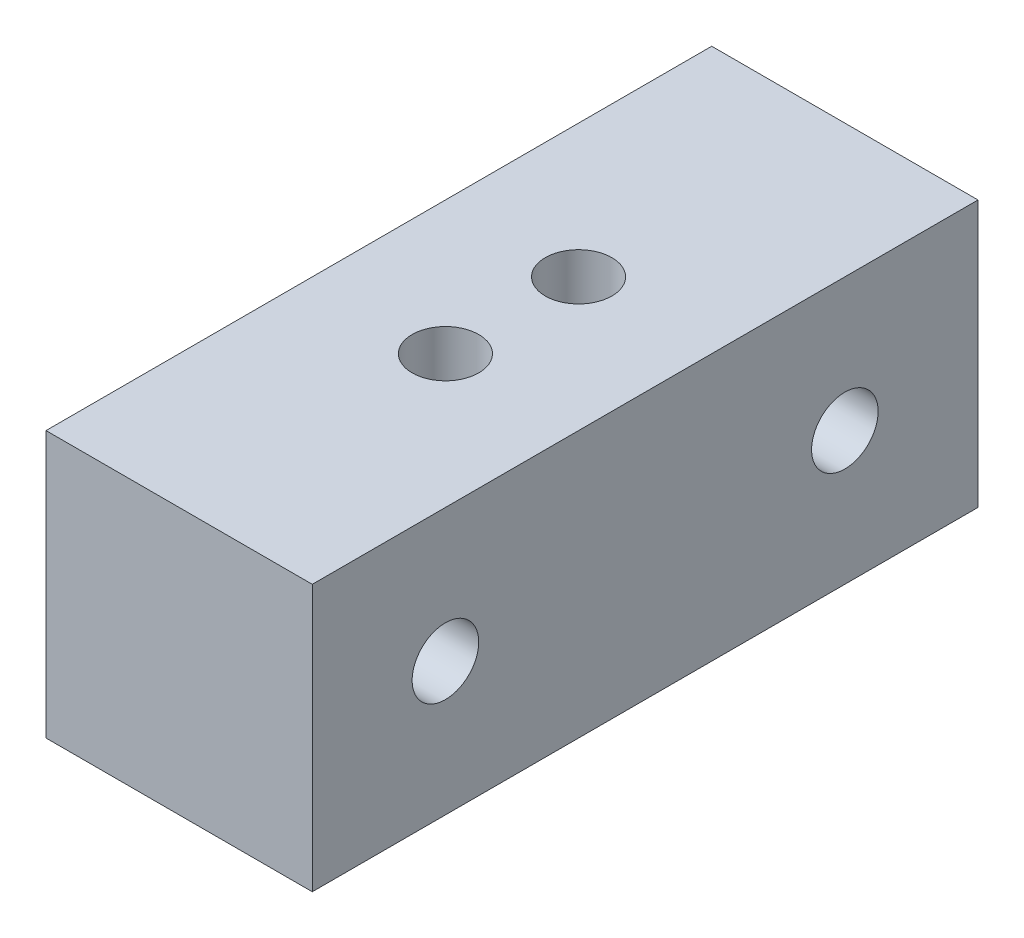
ISO-10303-21;
HEADER;
FILE_DESCRIPTION(('STEP AP214'),'2;1');
FILE_NAME('part.step','',(''),(''),'','','');
FILE_SCHEMA(('AUTOMOTIVE_DESIGN { 1 0 10303 214 1 1 1 1 }'));
ENDSEC;
DATA;
#1=APPLICATION_CONTEXT('core data for automotive mechanical design processes');
#2=APPLICATION_PROTOCOL_DEFINITION('international standard','automotive_design',2000,#1);
#3=PRODUCT_CONTEXT('',#1,'mechanical');
#4=PRODUCT('Part','Part','',(#3));
#5=PRODUCT_RELATED_PRODUCT_CATEGORY('part','',(#4));
#6=PRODUCT_DEFINITION_FORMATION('','',#4);
#7=PRODUCT_DEFINITION_CONTEXT('part definition',#1,'design');
#8=PRODUCT_DEFINITION('design','',#6,#7);
#9=PRODUCT_DEFINITION_SHAPE('','',#8);
#10=(LENGTH_UNIT() NAMED_UNIT(*) SI_UNIT(.MILLI.,.METRE.));
#11=(NAMED_UNIT(*) PLANE_ANGLE_UNIT() SI_UNIT($,.RADIAN.));
#12=(NAMED_UNIT(*) SI_UNIT($,.STERADIAN.) SOLID_ANGLE_UNIT());
#13=UNCERTAINTY_MEASURE_WITH_UNIT(LENGTH_MEASURE(1.E-05),#10,'distance_accuracy_value','');
#14=(GEOMETRIC_REPRESENTATION_CONTEXT(3) GLOBAL_UNCERTAINTY_ASSIGNED_CONTEXT((#13)) GLOBAL_UNIT_ASSIGNED_CONTEXT((#10,
#11,#12)) REPRESENTATION_CONTEXT('',''));
#15=CARTESIAN_POINT('',(0.,0.,0.));
#16=DIRECTION('',(0.,0.,1.));
#17=DIRECTION('',(1.,0.,0.));
#18=AXIS2_PLACEMENT_3D('',#15,#16,#17);
#19=CARTESIAN_POINT('',(0.,20.,50.));
#20=DIRECTION('',(1.,0.,0.));
#21=DIRECTION('',(0.,0.,-1.));
#22=AXIS2_PLACEMENT_3D('',#19,#20,#21);
#23=PLANE('',#22);
#24=DIRECTION('',(0.,-1.,0.));
#25=VECTOR('',#24,1.);
#26=CARTESIAN_POINT('',(0.,20.,0.));
#27=LINE('',#26,#25);
#28=CARTESIAN_POINT('',(0.,20.,0.));
#29=VERTEX_POINT('',#28);
#30=CARTESIAN_POINT('',(0.,0.,0.));
#31=VERTEX_POINT('',#30);
#32=EDGE_CURVE('E115',#29,#31,#27,.T.);
#33=ORIENTED_EDGE('',*,*,#32,.T.);
#34=DIRECTION('',(0.,0.,-1.));
#35=VECTOR('',#34,1.);
#36=CARTESIAN_POINT('',(0.,0.,50.));
#37=LINE('',#36,#35);
#38=CARTESIAN_POINT('',(0.,0.,50.));
#39=VERTEX_POINT('',#38);
#40=EDGE_CURVE('E11',#39,#31,#37,.T.);
#41=ORIENTED_EDGE('',*,*,#40,.F.);
#42=DIRECTION('',(0.,-1.,0.));
#43=VECTOR('',#42,1.);
#44=CARTESIAN_POINT('',(0.,20.,50.));
#45=LINE('',#44,#43);
#46=CARTESIAN_POINT('',(0.,20.,50.));
#47=VERTEX_POINT('',#46);
#48=EDGE_CURVE('E99',#47,#39,#45,.T.);
#49=ORIENTED_EDGE('',*,*,#48,.F.);
#50=DIRECTION('',(0.,0.,-1.));
#51=VECTOR('',#50,1.);
#52=CARTESIAN_POINT('',(0.,20.,50.));
#53=LINE('',#52,#51);
#54=EDGE_CURVE('E111',#47,#29,#53,.T.);
#55=ORIENTED_EDGE('',*,*,#54,.T.);
#56=EDGE_LOOP('',(#33,#41,#49,#55));
#57=FACE_BOUND('',#56,.T.);
#58=ADVANCED_FACE('F47',(#57),#23,.F.);
#59=CARTESIAN_POINT('',(0.,0.,50.));
#60=DIRECTION('',(0.,1.,0.));
#61=DIRECTION('',(0.,0.,1.));
#62=AXIS2_PLACEMENT_3D('',#59,#60,#61);
#63=PLANE('',#62);
#64=DIRECTION('',(1.,0.,0.));
#65=VECTOR('',#64,1.);
#66=CARTESIAN_POINT('',(0.,0.,0.));
#67=LINE('',#66,#65);
#68=CARTESIAN_POINT('',(20.,0.,0.));
#69=VERTEX_POINT('',#68);
#70=EDGE_CURVE('E104',#31,#69,#67,.T.);
#71=ORIENTED_EDGE('',*,*,#70,.T.);
#72=DIRECTION('',(0.,0.,-1.));
#73=VECTOR('',#72,1.);
#74=CARTESIAN_POINT('',(20.,0.,50.));
#75=LINE('',#74,#73);
#76=CARTESIAN_POINT('',(20.,0.,50.));
#77=VERTEX_POINT('',#76);
#78=EDGE_CURVE('E56',#77,#69,#75,.T.);
#79=ORIENTED_EDGE('',*,*,#78,.F.);
#80=DIRECTION('',(1.,0.,0.));
#81=VECTOR('',#80,1.);
#82=CARTESIAN_POINT('',(0.,0.,50.));
#83=LINE('',#82,#81);
#84=EDGE_CURVE('E94',#39,#77,#83,.T.);
#85=ORIENTED_EDGE('',*,*,#84,.F.);
#86=ORIENTED_EDGE('',*,*,#40,.T.);
#87=EDGE_LOOP('',(#71,#79,#85,#86));
#88=FACE_BOUND('',#87,.T.);
#89=ADVANCED_FACE('F103',(#88),#63,.F.);
#90=CARTESIAN_POINT('',(20.,0.,50.));
#91=DIRECTION('',(-1.,0.,0.));
#92=DIRECTION('',(0.,0.,1.));
#93=AXIS2_PLACEMENT_3D('',#90,#91,#92);
#94=PLANE('',#93);
#95=CARTESIAN_POINT('',(20.,10.,10.));
#96=DIRECTION('',(1.,0.,0.));
#97=DIRECTION('',(0.,0.,-1.));
#98=AXIS2_PLACEMENT_3D('',#95,#96,#97);
#99=CIRCLE('',#98,2.5);
#100=CARTESIAN_POINT('',(20.,10.,7.5));
#101=VERTEX_POINT('',#100);
#102=EDGE_CURVE('E145',#101,#101,#99,.T.);
#103=ORIENTED_EDGE('',*,*,#102,.F.);
#104=EDGE_LOOP('',(#103));
#105=FACE_BOUND('',#104,.T.);
#106=CARTESIAN_POINT('',(20.,10.,40.));
#107=DIRECTION('',(1.,0.,0.));
#108=DIRECTION('',(0.,0.,-1.));
#109=AXIS2_PLACEMENT_3D('',#106,#107,#108);
#110=CIRCLE('',#109,2.5);
#111=CARTESIAN_POINT('',(20.,10.,37.5));
#112=VERTEX_POINT('',#111);
#113=EDGE_CURVE('E140',#112,#112,#110,.T.);
#114=ORIENTED_EDGE('',*,*,#113,.F.);
#115=EDGE_LOOP('',(#114));
#116=FACE_BOUND('',#115,.T.);
#117=DIRECTION('',(0.,1.,0.));
#118=VECTOR('',#117,1.);
#119=CARTESIAN_POINT('',(20.,0.,0.));
#120=LINE('',#119,#118);
#121=CARTESIAN_POINT('',(20.,20.,0.));
#122=VERTEX_POINT('',#121);
#123=EDGE_CURVE('E81',#69,#122,#120,.T.);
#124=ORIENTED_EDGE('',*,*,#123,.T.);
#125=DIRECTION('',(0.,0.,-1.));
#126=VECTOR('',#125,1.);
#127=CARTESIAN_POINT('',(20.,20.,50.));
#128=LINE('',#127,#126);
#129=CARTESIAN_POINT('',(20.,20.,50.));
#130=VERTEX_POINT('',#129);
#131=EDGE_CURVE('E106',#130,#122,#128,.T.);
#132=ORIENTED_EDGE('',*,*,#131,.F.);
#133=DIRECTION('',(0.,1.,0.));
#134=VECTOR('',#133,1.);
#135=CARTESIAN_POINT('',(20.,0.,50.));
#136=LINE('',#135,#134);
#137=EDGE_CURVE('E97',#77,#130,#136,.T.);
#138=ORIENTED_EDGE('',*,*,#137,.F.);
#139=ORIENTED_EDGE('',*,*,#78,.T.);
#140=EDGE_LOOP('',(#124,#132,#138,#139));
#141=FACE_BOUND('',#140,.T.);
#142=ADVANCED_FACE('F107',(#105,#116,#141),#94,.F.);
#143=CARTESIAN_POINT('',(20.,20.,50.));
#144=DIRECTION('',(0.,-1.,0.));
#145=DIRECTION('',(0.,0.,-1.));
#146=AXIS2_PLACEMENT_3D('',#143,#144,#145);
#147=PLANE('',#146);
#148=CARTESIAN_POINT('',(10.,20.,20.));
#149=DIRECTION('',(0.,1.,0.));
#150=DIRECTION('',(0.,0.,1.));
#151=AXIS2_PLACEMENT_3D('',#148,#149,#150);
#152=CIRCLE('',#151,2.5);
#153=CARTESIAN_POINT('',(10.,20.,22.5));
#154=VERTEX_POINT('',#153);
#155=EDGE_CURVE('E160',#154,#154,#152,.T.);
#156=ORIENTED_EDGE('',*,*,#155,.F.);
#157=EDGE_LOOP('',(#156));
#158=FACE_BOUND('',#157,.T.);
#159=CARTESIAN_POINT('',(10.,20.,30.));
#160=DIRECTION('',(0.,1.,0.));
#161=DIRECTION('',(0.,0.,1.));
#162=AXIS2_PLACEMENT_3D('',#159,#160,#161);
#163=CIRCLE('',#162,2.5);
#164=CARTESIAN_POINT('',(10.,20.,32.5));
#165=VERTEX_POINT('',#164);
#166=EDGE_CURVE('E156',#165,#165,#163,.T.);
#167=ORIENTED_EDGE('',*,*,#166,.F.);
#168=EDGE_LOOP('',(#167));
#169=FACE_BOUND('',#168,.T.);
#170=DIRECTION('',(-1.,0.,0.));
#171=VECTOR('',#170,1.);
#172=CARTESIAN_POINT('',(20.,20.,0.));
#173=LINE('',#172,#171);
#174=EDGE_CURVE('E87',#122,#29,#173,.T.);
#175=ORIENTED_EDGE('',*,*,#174,.T.);
#176=ORIENTED_EDGE('',*,*,#54,.F.);
#177=DIRECTION('',(-1.,0.,0.));
#178=VECTOR('',#177,1.);
#179=CARTESIAN_POINT('',(20.,20.,50.));
#180=LINE('',#179,#178);
#181=EDGE_CURVE('E64',#130,#47,#180,.T.);
#182=ORIENTED_EDGE('',*,*,#181,.F.);
#183=ORIENTED_EDGE('',*,*,#131,.T.);
#184=EDGE_LOOP('',(#175,#176,#182,#183));
#185=FACE_BOUND('',#184,.T.);
#186=ADVANCED_FACE('F129',(#158,#169,#185),#147,.F.);
#187=CARTESIAN_POINT('',(0.,0.,50.));
#188=DIRECTION('',(0.,0.,1.));
#189=DIRECTION('',(1.,0.,0.));
#190=AXIS2_PLACEMENT_3D('',#187,#188,#189);
#191=PLANE('',#190);
#192=ORIENTED_EDGE('',*,*,#48,.T.);
#193=ORIENTED_EDGE('',*,*,#84,.T.);
#194=ORIENTED_EDGE('',*,*,#137,.T.);
#195=ORIENTED_EDGE('',*,*,#181,.T.);
#196=EDGE_LOOP('',(#192,#193,#194,#195));
#197=FACE_BOUND('',#196,.T.);
#198=ADVANCED_FACE('F95',(#197),#191,.T.);
#199=CARTESIAN_POINT('',(0.,0.,0.));
#200=DIRECTION('',(0.,0.,1.));
#201=DIRECTION('',(1.,0.,0.));
#202=AXIS2_PLACEMENT_3D('',#199,#200,#201);
#203=PLANE('',#202);
#204=ORIENTED_EDGE('',*,*,#32,.F.);
#205=ORIENTED_EDGE('',*,*,#174,.F.);
#206=ORIENTED_EDGE('',*,*,#123,.F.);
#207=ORIENTED_EDGE('',*,*,#70,.F.);
#208=EDGE_LOOP('',(#204,#205,#206,#207));
#209=FACE_BOUND('',#208,.T.);
#210=ADVANCED_FACE('F132',(#209),#203,.F.);
#211=CARTESIAN_POINT('',(6.,10.,40.));
#212=DIRECTION('',(1.,0.,0.));
#213=DIRECTION('',(0.,0.,-1.));
#214=AXIS2_PLACEMENT_3D('',#211,#212,#213);
#215=CYLINDRICAL_SURFACE('',#214,2.5);
#216=CARTESIAN_POINT('',(6.,10.,40.));
#217=DIRECTION('',(1.,0.,0.));
#218=DIRECTION('',(0.,0.,-1.));
#219=AXIS2_PLACEMENT_3D('',#216,#217,#218);
#220=CIRCLE('',#219,2.5);
#221=CARTESIAN_POINT('',(6.,10.,37.5));
#222=VERTEX_POINT('',#221);
#223=EDGE_CURVE('E136',#222,#222,#220,.T.);
#224=ORIENTED_EDGE('',*,*,#223,.F.);
#225=EDGE_LOOP('',(#224));
#226=FACE_BOUND('',#225,.T.);
#227=ORIENTED_EDGE('',*,*,#113,.T.);
#228=EDGE_LOOP('',(#227));
#229=FACE_BOUND('',#228,.T.);
#230=ADVANCED_FACE('F210',(#226,#229),#215,.F.);
#231=CARTESIAN_POINT('',(6.,10.,40.));
#232=DIRECTION('',(1.,0.,0.));
#233=DIRECTION('',(0.,0.,-1.));
#234=AXIS2_PLACEMENT_3D('',#231,#232,#233);
#235=PLANE('',#234);
#236=ORIENTED_EDGE('',*,*,#223,.T.);
#237=EDGE_LOOP('',(#236));
#238=FACE_BOUND('',#237,.T.);
#239=ADVANCED_FACE('F212',(#238),#235,.T.);
#240=CARTESIAN_POINT('',(6.,10.,10.));
#241=DIRECTION('',(1.,0.,0.));
#242=DIRECTION('',(0.,0.,-1.));
#243=AXIS2_PLACEMENT_3D('',#240,#241,#242);
#244=CYLINDRICAL_SURFACE('',#243,2.5);
#245=CARTESIAN_POINT('',(6.,10.,10.));
#246=DIRECTION('',(1.,0.,0.));
#247=DIRECTION('',(0.,0.,-1.));
#248=AXIS2_PLACEMENT_3D('',#245,#246,#247);
#249=CIRCLE('',#248,2.5);
#250=CARTESIAN_POINT('',(6.,10.,7.5));
#251=VERTEX_POINT('',#250);
#252=EDGE_CURVE('E119',#251,#251,#249,.T.);
#253=ORIENTED_EDGE('',*,*,#252,.F.);
#254=EDGE_LOOP('',(#253));
#255=FACE_BOUND('',#254,.T.);
#256=ORIENTED_EDGE('',*,*,#102,.T.);
#257=EDGE_LOOP('',(#256));
#258=FACE_BOUND('',#257,.T.);
#259=ADVANCED_FACE('F193',(#255,#258),#244,.F.);
#260=CARTESIAN_POINT('',(6.,10.,10.));
#261=DIRECTION('',(1.,0.,0.));
#262=DIRECTION('',(0.,0.,-1.));
#263=AXIS2_PLACEMENT_3D('',#260,#261,#262);
#264=PLANE('',#263);
#265=ORIENTED_EDGE('',*,*,#252,.T.);
#266=EDGE_LOOP('',(#265));
#267=FACE_BOUND('',#266,.T.);
#268=ADVANCED_FACE('F184',(#267),#264,.T.);
#269=CARTESIAN_POINT('',(10.,6.,30.));
#270=DIRECTION('',(0.,1.,0.));
#271=DIRECTION('',(0.,0.,1.));
#272=AXIS2_PLACEMENT_3D('',#269,#270,#271);
#273=CYLINDRICAL_SURFACE('',#272,2.5);
#274=CARTESIAN_POINT('',(10.,6.,30.));
#275=DIRECTION('',(0.,1.,0.));
#276=DIRECTION('',(0.,0.,1.));
#277=AXIS2_PLACEMENT_3D('',#274,#275,#276);
#278=CIRCLE('',#277,2.5);
#279=CARTESIAN_POINT('',(10.,6.,32.5));
#280=VERTEX_POINT('',#279);
#281=EDGE_CURVE('E152',#280,#280,#278,.T.);
#282=ORIENTED_EDGE('',*,*,#281,.F.);
#283=EDGE_LOOP('',(#282));
#284=FACE_BOUND('',#283,.T.);
#285=ORIENTED_EDGE('',*,*,#166,.T.);
#286=EDGE_LOOP('',(#285));
#287=FACE_BOUND('',#286,.T.);
#288=ADVANCED_FACE('F182',(#284,#287),#273,.F.);
#289=CARTESIAN_POINT('',(10.,6.,30.));
#290=DIRECTION('',(0.,1.,0.));
#291=DIRECTION('',(0.,0.,1.));
#292=AXIS2_PLACEMENT_3D('',#289,#290,#291);
#293=PLANE('',#292);
#294=ORIENTED_EDGE('',*,*,#281,.T.);
#295=EDGE_LOOP('',(#294));
#296=FACE_BOUND('',#295,.T.);
#297=ADVANCED_FACE('F173',(#296),#293,.T.);
#298=CARTESIAN_POINT('',(10.,6.,20.));
#299=DIRECTION('',(0.,1.,0.));
#300=DIRECTION('',(0.,0.,1.));
#301=AXIS2_PLACEMENT_3D('',#298,#299,#300);
#302=CYLINDRICAL_SURFACE('',#301,2.5);
#303=CARTESIAN_POINT('',(10.,6.,20.));
#304=DIRECTION('',(0.,1.,0.));
#305=DIRECTION('',(0.,0.,1.));
#306=AXIS2_PLACEMENT_3D('',#303,#304,#305);
#307=CIRCLE('',#306,2.5);
#308=CARTESIAN_POINT('',(10.,6.,22.5));
#309=VERTEX_POINT('',#308);
#310=EDGE_CURVE('E141',#309,#309,#307,.T.);
#311=ORIENTED_EDGE('',*,*,#310,.F.);
#312=EDGE_LOOP('',(#311));
#313=FACE_BOUND('',#312,.T.);
#314=ORIENTED_EDGE('',*,*,#155,.T.);
#315=EDGE_LOOP('',(#314));
#316=FACE_BOUND('',#315,.T.);
#317=ADVANCED_FACE('F170',(#313,#316),#302,.F.);
#318=CARTESIAN_POINT('',(10.,6.,20.));
#319=DIRECTION('',(0.,1.,0.));
#320=DIRECTION('',(0.,0.,1.));
#321=AXIS2_PLACEMENT_3D('',#318,#319,#320);
#322=PLANE('',#321);
#323=ORIENTED_EDGE('',*,*,#310,.T.);
#324=EDGE_LOOP('',(#323));
#325=FACE_BOUND('',#324,.T.);
#326=ADVANCED_FACE('F168',(#325),#322,.T.);
#327=CLOSED_SHELL('',(#58,#89,#142,#186,#198,#210,#230,#239,#259,#268,#288,#297,#317,#326));
#328=MANIFOLD_SOLID_BREP('B2',#327);
#329=ADVANCED_BREP_SHAPE_REPRESENTATION('',(#18,#328),#14);
#330=SHAPE_DEFINITION_REPRESENTATION(#9,#329);
ENDSEC;
END-ISO-10303-21;
